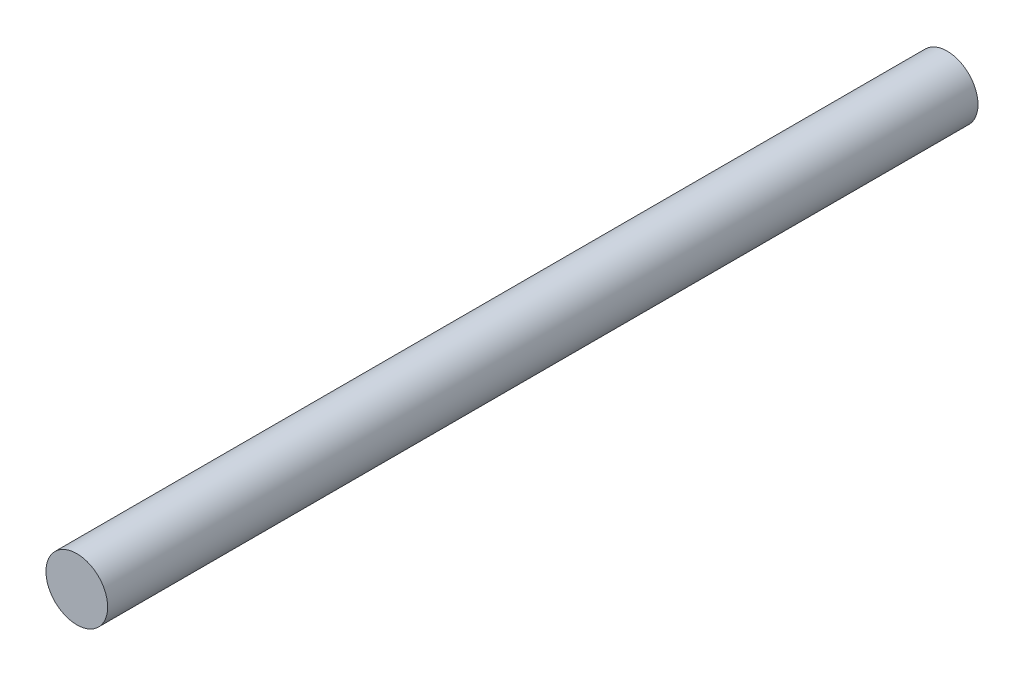
ISO-10303-21;
HEADER;
FILE_DESCRIPTION(('STEP AP214'),'2;1');
FILE_NAME('part.step','',(''),(''),'','','');
FILE_SCHEMA(('AUTOMOTIVE_DESIGN { 1 0 10303 214 1 1 1 1 }'));
ENDSEC;
DATA;
#1=APPLICATION_CONTEXT('core data for automotive mechanical design processes');
#2=APPLICATION_PROTOCOL_DEFINITION('international standard','automotive_design',2000,#1);
#3=PRODUCT_CONTEXT('',#1,'mechanical');
#4=PRODUCT('Part','Part','',(#3));
#5=PRODUCT_RELATED_PRODUCT_CATEGORY('part','',(#4));
#6=PRODUCT_DEFINITION_FORMATION('','',#4);
#7=PRODUCT_DEFINITION_CONTEXT('part definition',#1,'design');
#8=PRODUCT_DEFINITION('design','',#6,#7);
#9=PRODUCT_DEFINITION_SHAPE('','',#8);
#10=(LENGTH_UNIT() NAMED_UNIT(*) SI_UNIT(.MILLI.,.METRE.));
#11=(NAMED_UNIT(*) PLANE_ANGLE_UNIT() SI_UNIT($,.RADIAN.));
#12=(NAMED_UNIT(*) SI_UNIT($,.STERADIAN.) SOLID_ANGLE_UNIT());
#13=UNCERTAINTY_MEASURE_WITH_UNIT(LENGTH_MEASURE(1.E-05),#10,'distance_accuracy_value','');
#14=(GEOMETRIC_REPRESENTATION_CONTEXT(3) GLOBAL_UNCERTAINTY_ASSIGNED_CONTEXT((#13)) GLOBAL_UNIT_ASSIGNED_CONTEXT((#10,
#11,#12)) REPRESENTATION_CONTEXT('',''));
#15=CARTESIAN_POINT('',(0.,0.,0.));
#16=DIRECTION('',(0.,0.,1.));
#17=DIRECTION('',(1.,0.,0.));
#18=AXIS2_PLACEMENT_3D('',#15,#16,#17);
#19=CARTESIAN_POINT('',(0.,0.,141.));
#20=DIRECTION('',(0.,0.,-1.));
#21=DIRECTION('',(-1.,0.,0.));
#22=AXIS2_PLACEMENT_3D('',#19,#20,#21);
#23=CYLINDRICAL_SURFACE('',#22,5.);
#24=CARTESIAN_POINT('',(0.,0.,141.));
#25=DIRECTION('',(0.,0.,1.));
#26=DIRECTION('',(1.,0.,0.));
#27=AXIS2_PLACEMENT_3D('',#24,#25,#26);
#28=CIRCLE('',#27,5.);
#29=CARTESIAN_POINT('',(5.,0.,141.));
#30=VERTEX_POINT('',#29);
#31=EDGE_CURVE('E10',#30,#30,#28,.T.);
#32=ORIENTED_EDGE('',*,*,#31,.F.);
#33=EDGE_LOOP('',(#32));
#34=FACE_BOUND('',#33,.T.);
#35=CARTESIAN_POINT('',(0.,0.,0.));
#36=DIRECTION('',(0.,0.,1.));
#37=DIRECTION('',(1.,0.,0.));
#38=AXIS2_PLACEMENT_3D('',#35,#36,#37);
#39=CIRCLE('',#38,5.);
#40=CARTESIAN_POINT('',(5.,0.,0.));
#41=VERTEX_POINT('',#40);
#42=EDGE_CURVE('E44',#41,#41,#39,.T.);
#43=ORIENTED_EDGE('',*,*,#42,.T.);
#44=EDGE_LOOP('',(#43));
#45=FACE_BOUND('',#44,.T.);
#46=ADVANCED_FACE('F41',(#34,#45),#23,.T.);
#47=CARTESIAN_POINT('',(0.,0.,141.));
#48=DIRECTION('',(0.,0.,1.));
#49=DIRECTION('',(1.,0.,0.));
#50=AXIS2_PLACEMENT_3D('',#47,#48,#49);
#51=PLANE('',#50);
#52=ORIENTED_EDGE('',*,*,#31,.T.);
#53=EDGE_LOOP('',(#52));
#54=FACE_BOUND('',#53,.T.);
#55=ADVANCED_FACE('F58',(#54),#51,.T.);
#56=CARTESIAN_POINT('',(0.,0.,0.));
#57=DIRECTION('',(0.,0.,1.));
#58=DIRECTION('',(1.,0.,0.));
#59=AXIS2_PLACEMENT_3D('',#56,#57,#58);
#60=PLANE('',#59);
#61=ORIENTED_EDGE('',*,*,#42,.F.);
#62=EDGE_LOOP('',(#61));
#63=FACE_BOUND('',#62,.T.);
#64=ADVANCED_FACE('F56',(#63),#60,.F.);
#65=CLOSED_SHELL('',(#46,#55,#64));
#66=MANIFOLD_SOLID_BREP('B2',#65);
#67=ADVANCED_BREP_SHAPE_REPRESENTATION('',(#18,#66),#14);
#68=SHAPE_DEFINITION_REPRESENTATION(#9,#67);
ENDSEC;
END-ISO-10303-21;
